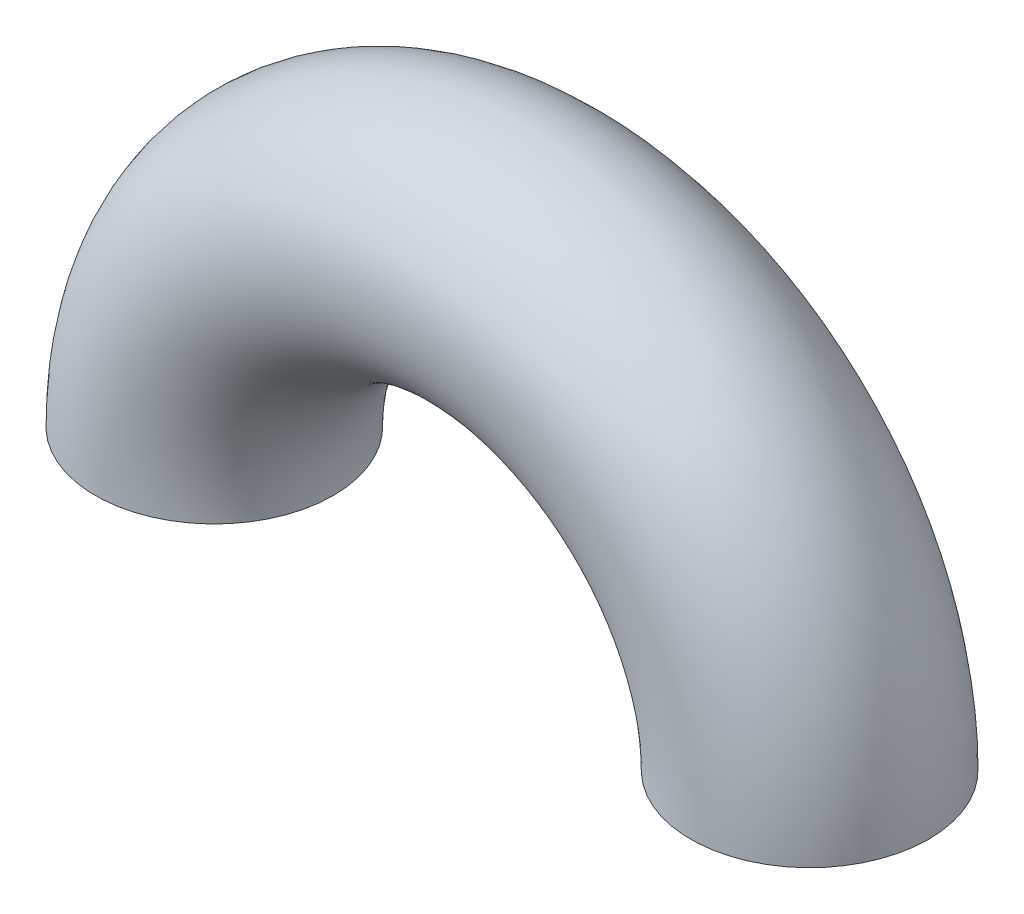
ISO-10303-21;
HEADER;
FILE_DESCRIPTION(('STEP AP214'),'2;1');
FILE_NAME('part.step','',(''),(''),'','','');
FILE_SCHEMA(('AUTOMOTIVE_DESIGN { 1 0 10303 214 1 1 1 1 }'));
ENDSEC;
DATA;
#1=APPLICATION_CONTEXT('core data for automotive mechanical design processes');
#2=APPLICATION_PROTOCOL_DEFINITION('international standard','automotive_design',2000,#1);
#3=PRODUCT_CONTEXT('',#1,'mechanical');
#4=PRODUCT('Part','Part','',(#3));
#5=PRODUCT_RELATED_PRODUCT_CATEGORY('part','',(#4));
#6=PRODUCT_DEFINITION_FORMATION('','',#4);
#7=PRODUCT_DEFINITION_CONTEXT('part definition',#1,'design');
#8=PRODUCT_DEFINITION('design','',#6,#7);
#9=PRODUCT_DEFINITION_SHAPE('','',#8);
#10=(LENGTH_UNIT() NAMED_UNIT(*) SI_UNIT(.MILLI.,.METRE.));
#11=(NAMED_UNIT(*) PLANE_ANGLE_UNIT() SI_UNIT($,.RADIAN.));
#12=(NAMED_UNIT(*) SI_UNIT($,.STERADIAN.) SOLID_ANGLE_UNIT());
#13=UNCERTAINTY_MEASURE_WITH_UNIT(LENGTH_MEASURE(1.E-05),#10,'distance_accuracy_value','');
#14=(GEOMETRIC_REPRESENTATION_CONTEXT(3) GLOBAL_UNCERTAINTY_ASSIGNED_CONTEXT((#13)) GLOBAL_UNIT_ASSIGNED_CONTEXT((#10,
#11,#12)) REPRESENTATION_CONTEXT('',''));
#15=CARTESIAN_POINT('',(0.,0.,0.));
#16=DIRECTION('',(0.,0.,1.));
#17=DIRECTION('',(1.,0.,0.));
#18=AXIS2_PLACEMENT_3D('',#15,#16,#17);
#19=CARTESIAN_POINT('',(-12.5,0.,0.));
#20=DIRECTION('',(0.,1.,0.));
#21=DIRECTION('',(0.,0.,1.));
#22=AXIS2_PLACEMENT_3D('',#19,#20,#21);
#23=PLANE('',#22);
#24=CARTESIAN_POINT('',(-12.5,0.,0.));
#25=DIRECTION('',(0.,1.,0.));
#26=DIRECTION('',(0.,0.,1.));
#27=AXIS2_PLACEMENT_3D('',#24,#25,#26);
#28=CIRCLE('',#27,4.5);
#29=CARTESIAN_POINT('',(-17.,0.,0.));
#30=VERTEX_POINT('',#29);
#31=EDGE_CURVE('E51',#30,#30,#28,.T.);
#32=ORIENTED_EDGE('',*,*,#31,.T.);
#33=EDGE_LOOP('',(#32));
#34=FACE_BOUND('',#33,.T.);
#35=CARTESIAN_POINT('',(-12.5,0.,0.));
#36=DIRECTION('',(0.,1.,0.));
#37=DIRECTION('',(0.,0.,1.));
#38=AXIS2_PLACEMENT_3D('',#35,#36,#37);
#39=CIRCLE('',#38,5.);
#40=CARTESIAN_POINT('',(-17.5,0.,0.));
#41=VERTEX_POINT('',#40);
#42=EDGE_CURVE('E43',#41,#41,#39,.T.);
#43=ORIENTED_EDGE('',*,*,#42,.F.);
#44=EDGE_LOOP('',(#43));
#45=FACE_BOUND('',#44,.T.);
#46=ADVANCED_FACE('F37',(#34,#45),#23,.F.);
#47=CARTESIAN_POINT('',(12.5,0.,0.));
#48=DIRECTION('',(0.,-1.,0.));
#49=DIRECTION('',(0.,0.,1.));
#50=AXIS2_PLACEMENT_3D('',#47,#48,#49);
#51=PLANE('',#50);
#52=CARTESIAN_POINT('',(12.5,0.,0.));
#53=DIRECTION('',(0.,-1.,0.));
#54=DIRECTION('',(1.,0.,0.));
#55=AXIS2_PLACEMENT_3D('',#52,#53,#54);
#56=CIRCLE('',#55,4.5);
#57=CARTESIAN_POINT('',(17.,0.,0.));
#58=VERTEX_POINT('',#57);
#59=EDGE_CURVE('E47',#58,#58,#56,.T.);
#60=ORIENTED_EDGE('',*,*,#59,.F.);
#61=EDGE_LOOP('',(#60));
#62=FACE_BOUND('',#61,.T.);
#63=CARTESIAN_POINT('',(12.5,0.,0.));
#64=DIRECTION('',(0.,-1.,0.));
#65=DIRECTION('',(0.,0.,1.));
#66=AXIS2_PLACEMENT_3D('',#63,#64,#65);
#67=CIRCLE('',#66,5.);
#68=CARTESIAN_POINT('',(17.5,0.,0.));
#69=VERTEX_POINT('',#68);
#70=EDGE_CURVE('E11',#69,#69,#67,.T.);
#71=ORIENTED_EDGE('',*,*,#70,.T.);
#72=EDGE_LOOP('',(#71));
#73=FACE_BOUND('',#72,.T.);
#74=ADVANCED_FACE('F67',(#62,#73),#51,.T.);
#75=CARTESIAN_POINT('',(0.,0.,0.));
#76=DIRECTION('',(0.,0.,-1.));
#77=DIRECTION('',(-1.,0.,0.));
#78=AXIS2_PLACEMENT_3D('',#75,#76,#77);
#79=TOROIDAL_SURFACE('',#78,12.5,5.);
#80=CARTESIAN_POINT('',(0.,0.,0.));
#81=DIRECTION('',(0.,0.,-1.));
#82=DIRECTION('',(-1.,0.,0.));
#83=AXIS2_PLACEMENT_3D('',#80,#81,#82);
#84=CIRCLE('',#83,17.5);
#85=EDGE_CURVE('',#41,#69,#84,.T.);
#86=ORIENTED_EDGE('',*,*,#42,.T.);
#87=ORIENTED_EDGE('',*,*,#70,.F.);
#88=ORIENTED_EDGE('',*,*,#85,.T.);
#89=ORIENTED_EDGE('',*,*,#85,.F.);
#90=EDGE_LOOP('',(#86,#88,#87,#89));
#91=FACE_BOUND('',#90,.T.);
#92=ADVANCED_FACE('F61',(#91),#79,.T.);
#93=CARTESIAN_POINT('',(0.,0.,0.));
#94=DIRECTION('',(0.,0.,-1.));
#95=DIRECTION('',(-1.,0.,0.));
#96=AXIS2_PLACEMENT_3D('',#93,#94,#95);
#97=TOROIDAL_SURFACE('',#96,12.5,4.5);
#98=CARTESIAN_POINT('',(0.,0.,0.));
#99=DIRECTION('',(0.,0.,-1.));
#100=DIRECTION('',(-1.,0.,0.));
#101=AXIS2_PLACEMENT_3D('',#98,#99,#100);
#102=CIRCLE('',#101,17.);
#103=EDGE_CURVE('',#30,#58,#102,.T.);
#104=ORIENTED_EDGE('',*,*,#31,.F.);
#105=ORIENTED_EDGE('',*,*,#59,.T.);
#106=ORIENTED_EDGE('',*,*,#103,.T.);
#107=ORIENTED_EDGE('',*,*,#103,.F.);
#108=EDGE_LOOP('',(#104,#106,#105,#107));
#109=FACE_BOUND('',#108,.T.);
#110=ADVANCED_FACE('F59',(#109),#97,.F.);
#111=CLOSED_SHELL('',(#46,#74,#92,#110));
#112=MANIFOLD_SOLID_BREP('B2',#111);
#113=ADVANCED_BREP_SHAPE_REPRESENTATION('',(#18,#112),#14);
#114=SHAPE_DEFINITION_REPRESENTATION(#9,#113);
ENDSEC;
END-ISO-10303-21;
